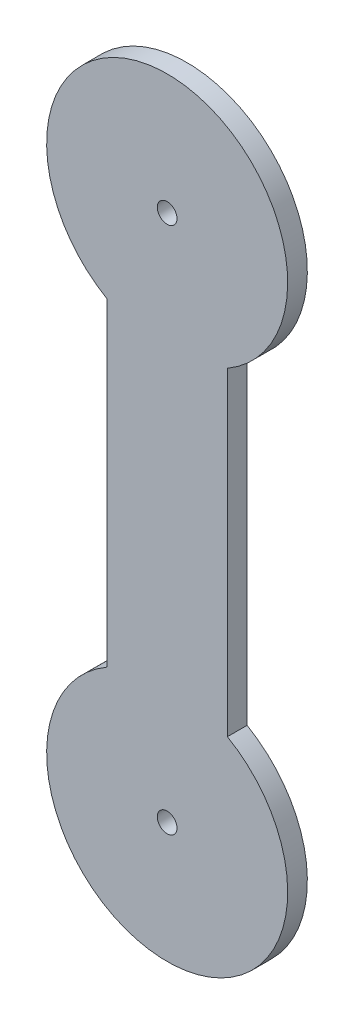
ISO-10303-21;
HEADER;
FILE_DESCRIPTION(('STEP AP214'),'2;1');
FILE_NAME('part.step','',(''),(''),'','','');
FILE_SCHEMA(('AUTOMOTIVE_DESIGN { 1 0 10303 214 1 1 1 1 }'));
ENDSEC;
DATA;
#1=APPLICATION_CONTEXT('core data for automotive mechanical design processes');
#2=APPLICATION_PROTOCOL_DEFINITION('international standard','automotive_design',2000,#1);
#3=PRODUCT_CONTEXT('',#1,'mechanical');
#4=PRODUCT('Part','Part','',(#3));
#5=PRODUCT_RELATED_PRODUCT_CATEGORY('part','',(#4));
#6=PRODUCT_DEFINITION_FORMATION('','',#4);
#7=PRODUCT_DEFINITION_CONTEXT('part definition',#1,'design');
#8=PRODUCT_DEFINITION('design','',#6,#7);
#9=PRODUCT_DEFINITION_SHAPE('','',#8);
#10=(LENGTH_UNIT() NAMED_UNIT(*) SI_UNIT(.MILLI.,.METRE.));
#11=(NAMED_UNIT(*) PLANE_ANGLE_UNIT() SI_UNIT($,.RADIAN.));
#12=(NAMED_UNIT(*) SI_UNIT($,.STERADIAN.) SOLID_ANGLE_UNIT());
#13=UNCERTAINTY_MEASURE_WITH_UNIT(LENGTH_MEASURE(1.E-05),#10,'distance_accuracy_value','');
#14=(GEOMETRIC_REPRESENTATION_CONTEXT(3) GLOBAL_UNCERTAINTY_ASSIGNED_CONTEXT((#13)) GLOBAL_UNIT_ASSIGNED_CONTEXT((#10,
#11,#12)) REPRESENTATION_CONTEXT('',''));
#15=CARTESIAN_POINT('',(0.,0.,0.));
#16=DIRECTION('',(0.,0.,1.));
#17=DIRECTION('',(1.,0.,0.));
#18=AXIS2_PLACEMENT_3D('',#15,#16,#17);
#19=CARTESIAN_POINT('',(19.05,0.,6.223));
#20=DIRECTION('',(0.,0.,-1.));
#21=DIRECTION('',(-1.,0.,0.));
#22=AXIS2_PLACEMENT_3D('',#19,#20,#21);
#23=CYLINDRICAL_SURFACE('',#22,38.1);
#24=CARTESIAN_POINT('',(19.05,0.,0.));
#25=DIRECTION('',(0.,0.,1.));
#26=DIRECTION('',(1.,0.,0.));
#27=AXIS2_PLACEMENT_3D('',#24,#25,#26);
#28=CIRCLE('',#27,38.1);
#29=CARTESIAN_POINT('',(0.,32.9955678841871,0.));
#30=VERTEX_POINT('',#29);
#31=CARTESIAN_POINT('',(38.1,32.9955678841871,0.));
#32=VERTEX_POINT('',#31);
#33=EDGE_CURVE('E103',#30,#32,#28,.T.);
#34=ORIENTED_EDGE('',*,*,#33,.T.);
#35=DIRECTION('',(0.,0.,-1.));
#36=VECTOR('',#35,1.);
#37=CARTESIAN_POINT('',(38.1,32.9955678841871,6.223));
#38=LINE('',#37,#36);
#39=CARTESIAN_POINT('',(38.1,32.9955678841871,6.223));
#40=VERTEX_POINT('',#39);
#41=EDGE_CURVE('E11',#40,#32,#38,.T.);
#42=ORIENTED_EDGE('',*,*,#41,.F.);
#43=CARTESIAN_POINT('',(19.05,0.,6.223));
#44=DIRECTION('',(0.,0.,1.));
#45=DIRECTION('',(1.,0.,0.));
#46=AXIS2_PLACEMENT_3D('',#43,#44,#45);
#47=CIRCLE('',#46,38.1);
#48=CARTESIAN_POINT('',(0.,32.9955678841871,6.223));
#49=VERTEX_POINT('',#48);
#50=EDGE_CURVE('E83',#49,#40,#47,.T.);
#51=ORIENTED_EDGE('',*,*,#50,.F.);
#52=DIRECTION('',(0.,0.,-1.));
#53=VECTOR('',#52,1.);
#54=CARTESIAN_POINT('',(0.,32.9955678841871,6.223));
#55=LINE('',#54,#53);
#56=EDGE_CURVE('E49',#49,#30,#55,.T.);
#57=ORIENTED_EDGE('',*,*,#56,.T.);
#58=EDGE_LOOP('',(#34,#42,#51,#57));
#59=FACE_BOUND('',#58,.T.);
#60=ADVANCED_FACE('F33',(#59),#23,.T.);
#61=CARTESIAN_POINT('',(38.1,-114.844994320303,6.223));
#62=DIRECTION('',(-1.,0.,0.));
#63=DIRECTION('',(0.,0.,1.));
#64=AXIS2_PLACEMENT_3D('',#61,#62,#63);
#65=PLANE('',#64);
#66=DIRECTION('',(0.,1.,0.));
#67=VECTOR('',#66,1.);
#68=CARTESIAN_POINT('',(38.1,-114.844994320303,0.));
#69=LINE('',#68,#67);
#70=CARTESIAN_POINT('',(38.1,133.882432115813,0.));
#71=VERTEX_POINT('',#70);
#72=EDGE_CURVE('E88',#32,#71,#69,.T.);
#73=ORIENTED_EDGE('',*,*,#72,.T.);
#74=DIRECTION('',(0.,0.,-1.));
#75=VECTOR('',#74,1.);
#76=CARTESIAN_POINT('',(38.1,133.882432115813,6.223));
#77=LINE('',#76,#75);
#78=CARTESIAN_POINT('',(38.1,133.882432115813,6.223));
#79=VERTEX_POINT('',#78);
#80=EDGE_CURVE('E41',#79,#71,#77,.T.);
#81=ORIENTED_EDGE('',*,*,#80,.F.);
#82=DIRECTION('',(0.,1.,0.));
#83=VECTOR('',#82,1.);
#84=CARTESIAN_POINT('',(38.1,-114.844994320303,6.223));
#85=LINE('',#84,#83);
#86=EDGE_CURVE('E75',#40,#79,#85,.T.);
#87=ORIENTED_EDGE('',*,*,#86,.F.);
#88=ORIENTED_EDGE('',*,*,#41,.T.);
#89=EDGE_LOOP('',(#73,#81,#87,#88));
#90=FACE_BOUND('',#89,.T.);
#91=ADVANCED_FACE('F87',(#90),#65,.F.);
#92=CARTESIAN_POINT('',(19.05,166.878,6.223));
#93=DIRECTION('',(0.,0.,-1.));
#94=DIRECTION('',(-1.,0.,0.));
#95=AXIS2_PLACEMENT_3D('',#92,#93,#94);
#96=CYLINDRICAL_SURFACE('',#95,38.1);
#97=CARTESIAN_POINT('',(19.05,166.878,0.));
#98=DIRECTION('',(0.,0.,1.));
#99=DIRECTION('',(1.,0.,0.));
#100=AXIS2_PLACEMENT_3D('',#97,#98,#99);
#101=CIRCLE('',#100,38.1);
#102=CARTESIAN_POINT('',(0.,133.882432115813,0.));
#103=VERTEX_POINT('',#102);
#104=EDGE_CURVE('E106',#71,#103,#101,.T.);
#105=ORIENTED_EDGE('',*,*,#104,.T.);
#106=DIRECTION('',(0.,0.,-1.));
#107=VECTOR('',#106,1.);
#108=CARTESIAN_POINT('',(0.,133.882432115813,6.223));
#109=LINE('',#108,#107);
#110=CARTESIAN_POINT('',(0.,133.882432115813,6.223));
#111=VERTEX_POINT('',#110);
#112=EDGE_CURVE('E64',#111,#103,#109,.T.);
#113=ORIENTED_EDGE('',*,*,#112,.F.);
#114=CARTESIAN_POINT('',(19.05,166.878,6.223));
#115=DIRECTION('',(0.,0.,1.));
#116=DIRECTION('',(1.,0.,0.));
#117=AXIS2_PLACEMENT_3D('',#114,#115,#116);
#118=CIRCLE('',#117,38.1);
#119=EDGE_CURVE('E82',#79,#111,#118,.T.);
#120=ORIENTED_EDGE('',*,*,#119,.F.);
#121=ORIENTED_EDGE('',*,*,#80,.T.);
#122=EDGE_LOOP('',(#105,#113,#120,#121));
#123=FACE_BOUND('',#122,.T.);
#124=ADVANCED_FACE('F91',(#123),#96,.T.);
#125=CARTESIAN_POINT('',(19.05,0.,6.223));
#126=DIRECTION('',(0.,0.,-1.));
#127=DIRECTION('',(-1.,0.,0.));
#128=AXIS2_PLACEMENT_3D('',#125,#126,#127);
#129=CYLINDRICAL_SURFACE('',#128,3.1115);
#130=CARTESIAN_POINT('',(19.05,0.,6.223));
#131=DIRECTION('',(0.,0.,1.));
#132=DIRECTION('',(1.,0.,0.));
#133=AXIS2_PLACEMENT_3D('',#130,#131,#132);
#134=CIRCLE('',#133,3.1115);
#135=CARTESIAN_POINT('',(22.1615,0.,6.223));
#136=VERTEX_POINT('',#135);
#137=EDGE_CURVE('E94',#136,#136,#134,.T.);
#138=ORIENTED_EDGE('',*,*,#137,.T.);
#139=EDGE_LOOP('',(#138));
#140=FACE_BOUND('',#139,.T.);
#141=CARTESIAN_POINT('',(19.05,0.,0.));
#142=DIRECTION('',(0.,0.,1.));
#143=DIRECTION('',(1.,0.,0.));
#144=AXIS2_PLACEMENT_3D('',#141,#142,#143);
#145=CIRCLE('',#144,3.1115);
#146=CARTESIAN_POINT('',(22.1615,0.,0.));
#147=VERTEX_POINT('',#146);
#148=EDGE_CURVE('E111',#147,#147,#145,.T.);
#149=ORIENTED_EDGE('',*,*,#148,.F.);
#150=EDGE_LOOP('',(#149));
#151=FACE_BOUND('',#150,.T.);
#152=ADVANCED_FACE('F132',(#140,#151),#129,.F.);
#153=CARTESIAN_POINT('',(0.,-114.844994320303,6.223));
#154=DIRECTION('',(-1.,0.,0.));
#155=DIRECTION('',(0.,0.,1.));
#156=AXIS2_PLACEMENT_3D('',#153,#154,#155);
#157=PLANE('',#156);
#158=DIRECTION('',(0.,1.,0.));
#159=VECTOR('',#158,1.);
#160=CARTESIAN_POINT('',(0.,-114.844994320303,0.));
#161=LINE('',#160,#159);
#162=EDGE_CURVE('E108',#30,#103,#161,.T.);
#163=ORIENTED_EDGE('',*,*,#162,.F.);
#164=ORIENTED_EDGE('',*,*,#56,.F.);
#165=DIRECTION('',(0.,1.,0.));
#166=VECTOR('',#165,1.);
#167=CARTESIAN_POINT('',(0.,-114.844994320303,6.223));
#168=LINE('',#167,#166);
#169=EDGE_CURVE('E92',#49,#111,#168,.T.);
#170=ORIENTED_EDGE('',*,*,#169,.T.);
#171=ORIENTED_EDGE('',*,*,#112,.T.);
#172=EDGE_LOOP('',(#163,#164,#170,#171));
#173=FACE_BOUND('',#172,.T.);
#174=ADVANCED_FACE('F124',(#173),#157,.T.);
#175=CARTESIAN_POINT('',(19.05,166.878,6.223));
#176=DIRECTION('',(0.,0.,-1.));
#177=DIRECTION('',(-1.,0.,0.));
#178=AXIS2_PLACEMENT_3D('',#175,#176,#177);
#179=CYLINDRICAL_SURFACE('',#178,3.1115);
#180=CARTESIAN_POINT('',(19.05,166.878,6.223));
#181=DIRECTION('',(0.,0.,1.));
#182=DIRECTION('',(1.,0.,0.));
#183=AXIS2_PLACEMENT_3D('',#180,#181,#182);
#184=CIRCLE('',#183,3.1115);
#185=CARTESIAN_POINT('',(22.1615,166.878,6.223));
#186=VERTEX_POINT('',#185);
#187=EDGE_CURVE('E100',#186,#186,#184,.T.);
#188=ORIENTED_EDGE('',*,*,#187,.T.);
#189=EDGE_LOOP('',(#188));
#190=FACE_BOUND('',#189,.T.);
#191=CARTESIAN_POINT('',(19.05,166.878,0.));
#192=DIRECTION('',(0.,0.,1.));
#193=DIRECTION('',(1.,0.,0.));
#194=AXIS2_PLACEMENT_3D('',#191,#192,#193);
#195=CIRCLE('',#194,3.1115);
#196=CARTESIAN_POINT('',(22.1615,166.878,0.));
#197=VERTEX_POINT('',#196);
#198=EDGE_CURVE('E114',#197,#197,#195,.T.);
#199=ORIENTED_EDGE('',*,*,#198,.F.);
#200=EDGE_LOOP('',(#199));
#201=FACE_BOUND('',#200,.T.);
#202=ADVANCED_FACE('F122',(#190,#201),#179,.F.);
#203=CARTESIAN_POINT('',(19.05,-114.844994320303,6.223));
#204=DIRECTION('',(0.,0.,1.));
#205=DIRECTION('',(1.,0.,0.));
#206=AXIS2_PLACEMENT_3D('',#203,#204,#205);
#207=PLANE('',#206);
#208=ORIENTED_EDGE('',*,*,#50,.T.);
#209=ORIENTED_EDGE('',*,*,#86,.T.);
#210=ORIENTED_EDGE('',*,*,#119,.T.);
#211=ORIENTED_EDGE('',*,*,#169,.F.);
#212=EDGE_LOOP('',(#208,#209,#210,#211));
#213=FACE_BOUND('',#212,.T.);
#214=ORIENTED_EDGE('',*,*,#137,.F.);
#215=EDGE_LOOP('',(#214));
#216=FACE_BOUND('',#215,.T.);
#217=ORIENTED_EDGE('',*,*,#187,.F.);
#218=EDGE_LOOP('',(#217));
#219=FACE_BOUND('',#218,.T.);
#220=ADVANCED_FACE('F78',(#213,#216,#219),#207,.T.);
#221=CARTESIAN_POINT('',(19.05,-114.844994320303,0.));
#222=DIRECTION('',(0.,0.,1.));
#223=DIRECTION('',(1.,0.,0.));
#224=AXIS2_PLACEMENT_3D('',#221,#222,#223);
#225=PLANE('',#224);
#226=ORIENTED_EDGE('',*,*,#33,.F.);
#227=ORIENTED_EDGE('',*,*,#162,.T.);
#228=ORIENTED_EDGE('',*,*,#104,.F.);
#229=ORIENTED_EDGE('',*,*,#72,.F.);
#230=EDGE_LOOP('',(#226,#227,#228,#229));
#231=FACE_BOUND('',#230,.T.);
#232=ORIENTED_EDGE('',*,*,#148,.T.);
#233=EDGE_LOOP('',(#232));
#234=FACE_BOUND('',#233,.T.);
#235=ORIENTED_EDGE('',*,*,#198,.T.);
#236=EDGE_LOOP('',(#235));
#237=FACE_BOUND('',#236,.T.);
#238=ADVANCED_FACE('F120',(#231,#234,#237),#225,.F.);
#239=CLOSED_SHELL('',(#60,#91,#124,#152,#174,#202,#220,#238));
#240=MANIFOLD_SOLID_BREP('B2',#239);
#241=ADVANCED_BREP_SHAPE_REPRESENTATION('',(#18,#240),#14);
#242=SHAPE_DEFINITION_REPRESENTATION(#9,#241);
ENDSEC;
END-ISO-10303-21;
